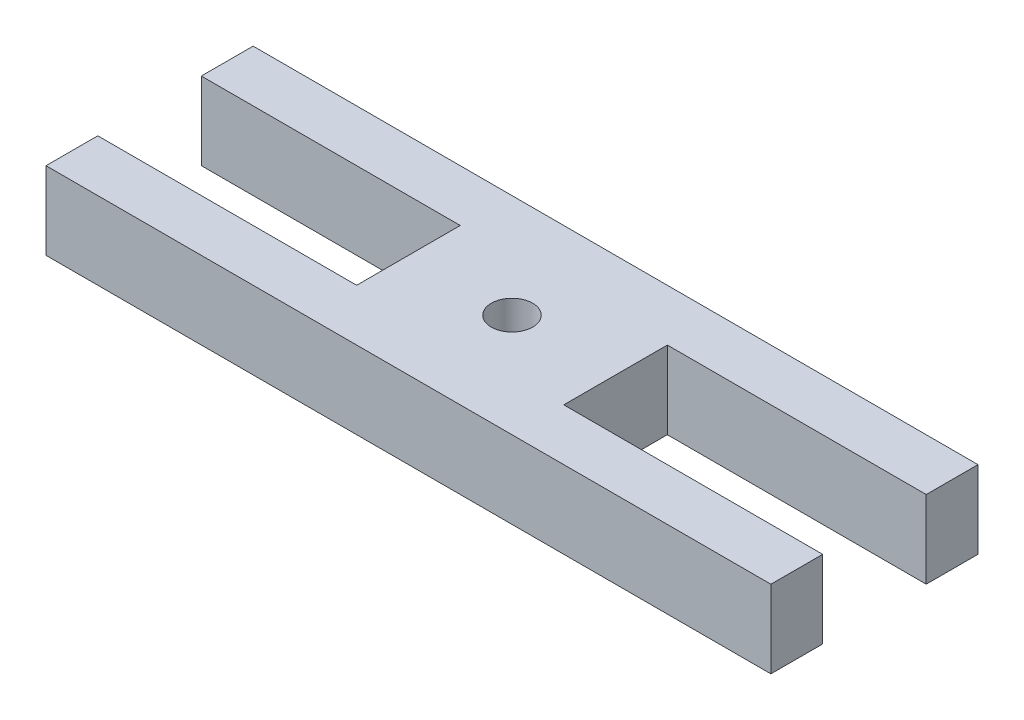
ISO-10303-21;
HEADER;
FILE_DESCRIPTION(('STEP AP214'),'2;1');
FILE_NAME('part.step','',(''),(''),'','','');
FILE_SCHEMA(('AUTOMOTIVE_DESIGN { 1 0 10303 214 1 1 1 1 }'));
ENDSEC;
DATA;
#1=APPLICATION_CONTEXT('core data for automotive mechanical design processes');
#2=APPLICATION_PROTOCOL_DEFINITION('international standard','automotive_design',2000,#1);
#3=PRODUCT_CONTEXT('',#1,'mechanical');
#4=PRODUCT('Part','Part','',(#3));
#5=PRODUCT_RELATED_PRODUCT_CATEGORY('part','',(#4));
#6=PRODUCT_DEFINITION_FORMATION('','',#4);
#7=PRODUCT_DEFINITION_CONTEXT('part definition',#1,'design');
#8=PRODUCT_DEFINITION('design','',#6,#7);
#9=PRODUCT_DEFINITION_SHAPE('','',#8);
#10=(LENGTH_UNIT() NAMED_UNIT(*) SI_UNIT(.MILLI.,.METRE.));
#11=(NAMED_UNIT(*) PLANE_ANGLE_UNIT() SI_UNIT($,.RADIAN.));
#12=(NAMED_UNIT(*) SI_UNIT($,.STERADIAN.) SOLID_ANGLE_UNIT());
#13=UNCERTAINTY_MEASURE_WITH_UNIT(LENGTH_MEASURE(1.E-05),#10,'distance_accuracy_value','');
#14=(GEOMETRIC_REPRESENTATION_CONTEXT(3) GLOBAL_UNCERTAINTY_ASSIGNED_CONTEXT((#13)) GLOBAL_UNIT_ASSIGNED_CONTEXT((#10,
#11,#12)) REPRESENTATION_CONTEXT('',''));
#15=CARTESIAN_POINT('',(0.,0.,0.));
#16=DIRECTION('',(0.,0.,1.));
#17=DIRECTION('',(1.,0.,0.));
#18=AXIS2_PLACEMENT_3D('',#15,#16,#17);
#19=CARTESIAN_POINT('',(-34.5830738893269,1.5,0.));
#20=DIRECTION('',(-1.,0.,0.));
#21=DIRECTION('',(0.,0.,1.));
#22=AXIS2_PLACEMENT_3D('',#19,#20,#21);
#23=PLANE('',#22);
#24=DIRECTION('',(0.,0.,-1.));
#25=VECTOR('',#24,1.);
#26=CARTESIAN_POINT('',(-34.5830738893269,0.,0.));
#27=LINE('',#26,#25);
#28=CARTESIAN_POINT('',(-34.5830738893269,0.,-22.4061702796662));
#29=VERTEX_POINT('',#28);
#30=CARTESIAN_POINT('',(-34.5830738893269,0.,-23.4061702796662));
#31=VERTEX_POINT('',#30);
#32=EDGE_CURVE('E155',#29,#31,#27,.T.);
#33=ORIENTED_EDGE('',*,*,#32,.F.);
#34=DIRECTION('',(0.,-1.,0.));
#35=VECTOR('',#34,1.);
#36=CARTESIAN_POINT('',(-34.5830738893269,1.5,-22.4061702796662));
#37=LINE('',#36,#35);
#38=CARTESIAN_POINT('',(-34.5830738893269,1.5,-22.4061702796662));
#39=VERTEX_POINT('',#38);
#40=EDGE_CURVE('E11',#39,#29,#37,.T.);
#41=ORIENTED_EDGE('',*,*,#40,.F.);
#42=DIRECTION('',(0.,0.,-1.));
#43=VECTOR('',#42,1.);
#44=CARTESIAN_POINT('',(-34.5830738893269,1.5,0.));
#45=LINE('',#44,#43);
#46=CARTESIAN_POINT('',(-34.5830738893269,1.5,-23.4061702796662));
#47=VERTEX_POINT('',#46);
#48=EDGE_CURVE('E229',#39,#47,#45,.T.);
#49=ORIENTED_EDGE('',*,*,#48,.T.);
#50=DIRECTION('',(0.,-1.,0.));
#51=VECTOR('',#50,1.);
#52=CARTESIAN_POINT('',(-34.5830738893269,1.5,-23.4061702796662));
#53=LINE('',#52,#51);
#54=EDGE_CURVE('E52',#47,#31,#53,.T.);
#55=ORIENTED_EDGE('',*,*,#54,.T.);
#56=EDGE_LOOP('',(#33,#41,#49,#55));
#57=FACE_BOUND('',#56,.T.);
#58=ADVANCED_FACE('F35',(#57),#23,.T.);
#59=CARTESIAN_POINT('',(0.,1.5,-22.4061702796662));
#60=DIRECTION('',(0.,0.,1.));
#61=DIRECTION('',(1.,0.,0.));
#62=AXIS2_PLACEMENT_3D('',#59,#60,#61);
#63=PLANE('',#62);
#64=DIRECTION('',(-1.,0.,0.));
#65=VECTOR('',#64,1.);
#66=CARTESIAN_POINT('',(0.,0.,-22.4061702796662));
#67=LINE('',#66,#65);
#68=CARTESIAN_POINT('',(-20.5830738893269,0.,-22.4061702796662));
#69=VERTEX_POINT('',#68);
#70=EDGE_CURVE('E157',#69,#29,#67,.T.);
#71=ORIENTED_EDGE('',*,*,#70,.F.);
#72=DIRECTION('',(0.,-1.,0.));
#73=VECTOR('',#72,1.);
#74=CARTESIAN_POINT('',(-20.5830738893269,1.5,-22.4061702796662));
#75=LINE('',#74,#73);
#76=CARTESIAN_POINT('',(-20.5830738893269,1.5,-22.4061702796662));
#77=VERTEX_POINT('',#76);
#78=EDGE_CURVE('E44',#77,#69,#75,.T.);
#79=ORIENTED_EDGE('',*,*,#78,.F.);
#80=DIRECTION('',(-1.,0.,0.));
#81=VECTOR('',#80,1.);
#82=CARTESIAN_POINT('',(0.,1.5,-22.4061702796662));
#83=LINE('',#82,#81);
#84=EDGE_CURVE('E225',#77,#39,#83,.T.);
#85=ORIENTED_EDGE('',*,*,#84,.T.);
#86=ORIENTED_EDGE('',*,*,#40,.T.);
#87=EDGE_LOOP('',(#71,#79,#85,#86));
#88=FACE_BOUND('',#87,.T.);
#89=ADVANCED_FACE('F213',(#88),#63,.T.);
#90=CARTESIAN_POINT('',(-20.5830738893269,1.5,0.));
#91=DIRECTION('',(1.,0.,0.));
#92=DIRECTION('',(0.,0.,-1.));
#93=AXIS2_PLACEMENT_3D('',#90,#91,#92);
#94=PLANE('',#93);
#95=DIRECTION('',(0.,0.,1.));
#96=VECTOR('',#95,1.);
#97=CARTESIAN_POINT('',(-20.5830738893269,0.,0.));
#98=LINE('',#97,#96);
#99=CARTESIAN_POINT('',(-20.5830738893269,0.,-23.4061702796662));
#100=VERTEX_POINT('',#99);
#101=EDGE_CURVE('E160',#100,#69,#98,.T.);
#102=ORIENTED_EDGE('',*,*,#101,.F.);
#103=DIRECTION('',(0.,-1.,0.));
#104=VECTOR('',#103,1.);
#105=CARTESIAN_POINT('',(-20.5830738893269,1.5,-23.4061702796662));
#106=LINE('',#105,#104);
#107=CARTESIAN_POINT('',(-20.5830738893269,1.5,-23.4061702796662));
#108=VERTEX_POINT('',#107);
#109=EDGE_CURVE('E202',#108,#100,#106,.T.);
#110=ORIENTED_EDGE('',*,*,#109,.F.);
#111=DIRECTION('',(0.,0.,1.));
#112=VECTOR('',#111,1.);
#113=CARTESIAN_POINT('',(-20.5830738893269,1.5,0.));
#114=LINE('',#113,#112);
#115=EDGE_CURVE('E209',#108,#77,#114,.T.);
#116=ORIENTED_EDGE('',*,*,#115,.T.);
#117=ORIENTED_EDGE('',*,*,#78,.T.);
#118=EDGE_LOOP('',(#102,#110,#116,#117));
#119=FACE_BOUND('',#118,.T.);
#120=ADVANCED_FACE('F207',(#119),#94,.T.);
#121=CARTESIAN_POINT('',(0.,1.5,-23.4061702796662));
#122=DIRECTION('',(0.,0.,-1.));
#123=DIRECTION('',(-1.,0.,0.));
#124=AXIS2_PLACEMENT_3D('',#121,#122,#123);
#125=PLANE('',#124);
#126=DIRECTION('',(1.,0.,0.));
#127=VECTOR('',#126,1.);
#128=CARTESIAN_POINT('',(0.,0.,-23.4061702796662));
#129=LINE('',#128,#127);
#130=CARTESIAN_POINT('',(-25.5830738893269,0.,-23.4061702796662));
#131=VERTEX_POINT('',#130);
#132=EDGE_CURVE('E163',#131,#100,#129,.T.);
#133=ORIENTED_EDGE('',*,*,#132,.F.);
#134=DIRECTION('',(0.,-1.,0.));
#135=VECTOR('',#134,1.);
#136=CARTESIAN_POINT('',(-25.5830738893269,1.5,-23.4061702796662));
#137=LINE('',#136,#135);
#138=CARTESIAN_POINT('',(-25.5830738893269,1.5,-23.4061702796662));
#139=VERTEX_POINT('',#138);
#140=EDGE_CURVE('E200',#139,#131,#137,.T.);
#141=ORIENTED_EDGE('',*,*,#140,.F.);
#142=DIRECTION('',(1.,0.,0.));
#143=VECTOR('',#142,1.);
#144=CARTESIAN_POINT('',(0.,1.5,-23.4061702796662));
#145=LINE('',#144,#143);
#146=EDGE_CURVE('E222',#139,#108,#145,.T.);
#147=ORIENTED_EDGE('',*,*,#146,.T.);
#148=ORIENTED_EDGE('',*,*,#109,.T.);
#149=EDGE_LOOP('',(#133,#141,#147,#148));
#150=FACE_BOUND('',#149,.T.);
#151=ADVANCED_FACE('F219',(#150),#125,.T.);
#152=CARTESIAN_POINT('',(-25.5830738893269,1.5,0.));
#153=DIRECTION('',(1.,0.,0.));
#154=DIRECTION('',(0.,0.,-1.));
#155=AXIS2_PLACEMENT_3D('',#152,#153,#154);
#156=PLANE('',#155);
#157=DIRECTION('',(0.,0.,1.));
#158=VECTOR('',#157,1.);
#159=CARTESIAN_POINT('',(-25.5830738893269,0.,0.));
#160=LINE('',#159,#158);
#161=CARTESIAN_POINT('',(-25.5830738893269,0.,-25.4061702796662));
#162=VERTEX_POINT('',#161);
#163=EDGE_CURVE('E166',#162,#131,#160,.T.);
#164=ORIENTED_EDGE('',*,*,#163,.F.);
#165=DIRECTION('',(0.,-1.,0.));
#166=VECTOR('',#165,1.);
#167=CARTESIAN_POINT('',(-25.5830738893269,1.5,-25.4061702796662));
#168=LINE('',#167,#166);
#169=CARTESIAN_POINT('',(-25.5830738893269,1.5,-25.4061702796662));
#170=VERTEX_POINT('',#169);
#171=EDGE_CURVE('E198',#170,#162,#168,.T.);
#172=ORIENTED_EDGE('',*,*,#171,.F.);
#173=DIRECTION('',(0.,0.,1.));
#174=VECTOR('',#173,1.);
#175=CARTESIAN_POINT('',(-25.5830738893269,1.5,0.));
#176=LINE('',#175,#174);
#177=EDGE_CURVE('E227',#170,#139,#176,.T.);
#178=ORIENTED_EDGE('',*,*,#177,.T.);
#179=ORIENTED_EDGE('',*,*,#140,.T.);
#180=EDGE_LOOP('',(#164,#172,#178,#179));
#181=FACE_BOUND('',#180,.T.);
#182=ADVANCED_FACE('F267',(#181),#156,.T.);
#183=CARTESIAN_POINT('',(0.,1.5,-25.4061702796662));
#184=DIRECTION('',(0.,0.,1.));
#185=DIRECTION('',(1.,0.,0.));
#186=AXIS2_PLACEMENT_3D('',#183,#184,#185);
#187=PLANE('',#186);
#188=DIRECTION('',(-1.,0.,0.));
#189=VECTOR('',#188,1.);
#190=CARTESIAN_POINT('',(0.,0.,-25.4061702796662));
#191=LINE('',#190,#189);
#192=CARTESIAN_POINT('',(-20.5830738893269,0.,-25.4061702796662));
#193=VERTEX_POINT('',#192);
#194=EDGE_CURVE('E169',#193,#162,#191,.T.);
#195=ORIENTED_EDGE('',*,*,#194,.F.);
#196=DIRECTION('',(0.,-1.,0.));
#197=VECTOR('',#196,1.);
#198=CARTESIAN_POINT('',(-20.5830738893269,1.5,-25.4061702796662));
#199=LINE('',#198,#197);
#200=CARTESIAN_POINT('',(-20.5830738893269,1.5,-25.4061702796662));
#201=VERTEX_POINT('',#200);
#202=EDGE_CURVE('E196',#201,#193,#199,.T.);
#203=ORIENTED_EDGE('',*,*,#202,.F.);
#204=DIRECTION('',(-1.,0.,0.));
#205=VECTOR('',#204,1.);
#206=CARTESIAN_POINT('',(0.,1.5,-25.4061702796662));
#207=LINE('',#206,#205);
#208=EDGE_CURVE('E234',#201,#170,#207,.T.);
#209=ORIENTED_EDGE('',*,*,#208,.T.);
#210=ORIENTED_EDGE('',*,*,#171,.T.);
#211=EDGE_LOOP('',(#195,#203,#209,#210));
#212=FACE_BOUND('',#211,.T.);
#213=ADVANCED_FACE('F270',(#212),#187,.T.);
#214=CARTESIAN_POINT('',(-20.5830738893269,1.5,0.));
#215=DIRECTION('',(-1.,0.,0.));
#216=DIRECTION('',(0.,0.,1.));
#217=AXIS2_PLACEMENT_3D('',#214,#215,#216);
#218=PLANE('',#217);
#219=DIRECTION('',(0.,0.,-1.));
#220=VECTOR('',#219,1.);
#221=CARTESIAN_POINT('',(-20.5830738893269,0.,0.));
#222=LINE('',#221,#220);
#223=CARTESIAN_POINT('',(-20.5830738893269,0.,-26.4061702796662));
#224=VERTEX_POINT('',#223);
#225=EDGE_CURVE('E172',#193,#224,#222,.T.);
#226=ORIENTED_EDGE('',*,*,#225,.T.);
#227=DIRECTION('',(0.,-1.,0.));
#228=VECTOR('',#227,1.);
#229=CARTESIAN_POINT('',(-20.5830738893269,1.5,-26.4061702796662));
#230=LINE('',#229,#228);
#231=CARTESIAN_POINT('',(-20.5830738893269,1.5,-26.4061702796662));
#232=VERTEX_POINT('',#231);
#233=EDGE_CURVE('E193',#232,#224,#230,.T.);
#234=ORIENTED_EDGE('',*,*,#233,.F.);
#235=DIRECTION('',(0.,0.,-1.));
#236=VECTOR('',#235,1.);
#237=CARTESIAN_POINT('',(-20.5830738893269,1.5,0.));
#238=LINE('',#237,#236);
#239=EDGE_CURVE('E237',#201,#232,#238,.T.);
#240=ORIENTED_EDGE('',*,*,#239,.F.);
#241=ORIENTED_EDGE('',*,*,#202,.T.);
#242=EDGE_LOOP('',(#226,#234,#240,#241));
#243=FACE_BOUND('',#242,.T.);
#244=ADVANCED_FACE('F274',(#243),#218,.F.);
#245=CARTESIAN_POINT('',(0.,1.5,-26.4061702796662));
#246=DIRECTION('',(0.,0.,1.));
#247=DIRECTION('',(1.,0.,0.));
#248=AXIS2_PLACEMENT_3D('',#245,#246,#247);
#249=PLANE('',#248);
#250=DIRECTION('',(-1.,0.,0.));
#251=VECTOR('',#250,1.);
#252=CARTESIAN_POINT('',(0.,0.,-26.4061702796662));
#253=LINE('',#252,#251);
#254=CARTESIAN_POINT('',(-34.5830738893269,0.,-26.4061702796662));
#255=VERTEX_POINT('',#254);
#256=EDGE_CURVE('E175',#224,#255,#253,.T.);
#257=ORIENTED_EDGE('',*,*,#256,.T.);
#258=DIRECTION('',(0.,-1.,0.));
#259=VECTOR('',#258,1.);
#260=CARTESIAN_POINT('',(-34.5830738893269,1.5,-26.4061702796662));
#261=LINE('',#260,#259);
#262=CARTESIAN_POINT('',(-34.5830738893269,1.5,-26.4061702796662));
#263=VERTEX_POINT('',#262);
#264=EDGE_CURVE('E191',#263,#255,#261,.T.);
#265=ORIENTED_EDGE('',*,*,#264,.F.);
#266=DIRECTION('',(-1.,0.,0.));
#267=VECTOR('',#266,1.);
#268=CARTESIAN_POINT('',(0.,1.5,-26.4061702796662));
#269=LINE('',#268,#267);
#270=EDGE_CURVE('E240',#232,#263,#269,.T.);
#271=ORIENTED_EDGE('',*,*,#270,.F.);
#272=ORIENTED_EDGE('',*,*,#233,.T.);
#273=EDGE_LOOP('',(#257,#265,#271,#272));
#274=FACE_BOUND('',#273,.T.);
#275=ADVANCED_FACE('F278',(#274),#249,.F.);
#276=CARTESIAN_POINT('',(-34.5830738893269,1.5,0.));
#277=DIRECTION('',(-1.,0.,0.));
#278=DIRECTION('',(0.,0.,1.));
#279=AXIS2_PLACEMENT_3D('',#276,#277,#278);
#280=PLANE('',#279);
#281=DIRECTION('',(0.,0.,-1.));
#282=VECTOR('',#281,1.);
#283=CARTESIAN_POINT('',(-34.5830738893269,0.,0.));
#284=LINE('',#283,#282);
#285=CARTESIAN_POINT('',(-34.5830738893269,0.,-25.4061702796662));
#286=VERTEX_POINT('',#285);
#287=EDGE_CURVE('E178',#286,#255,#284,.T.);
#288=ORIENTED_EDGE('',*,*,#287,.F.);
#289=DIRECTION('',(0.,-1.,0.));
#290=VECTOR('',#289,1.);
#291=CARTESIAN_POINT('',(-34.5830738893269,1.5,-25.4061702796662));
#292=LINE('',#291,#290);
#293=CARTESIAN_POINT('',(-34.5830738893269,1.5,-25.4061702796662));
#294=VERTEX_POINT('',#293);
#295=EDGE_CURVE('E135',#294,#286,#292,.T.);
#296=ORIENTED_EDGE('',*,*,#295,.F.);
#297=DIRECTION('',(0.,0.,-1.));
#298=VECTOR('',#297,1.);
#299=CARTESIAN_POINT('',(-34.5830738893269,1.5,0.));
#300=LINE('',#299,#298);
#301=EDGE_CURVE('E144',#294,#263,#300,.T.);
#302=ORIENTED_EDGE('',*,*,#301,.T.);
#303=ORIENTED_EDGE('',*,*,#264,.T.);
#304=EDGE_LOOP('',(#288,#296,#302,#303));
#305=FACE_BOUND('',#304,.T.);
#306=ADVANCED_FACE('F243',(#305),#280,.T.);
#307=CARTESIAN_POINT('',(0.,1.5,-25.4061702796662));
#308=DIRECTION('',(0.,0.,1.));
#309=DIRECTION('',(1.,0.,0.));
#310=AXIS2_PLACEMENT_3D('',#307,#308,#309);
#311=PLANE('',#310);
#312=DIRECTION('',(-1.,0.,0.));
#313=VECTOR('',#312,1.);
#314=CARTESIAN_POINT('',(0.,0.,-25.4061702796662));
#315=LINE('',#314,#313);
#316=CARTESIAN_POINT('',(-29.5830738893269,0.,-25.4061702796662));
#317=VERTEX_POINT('',#316);
#318=EDGE_CURVE('E131',#317,#286,#315,.T.);
#319=ORIENTED_EDGE('',*,*,#318,.F.);
#320=DIRECTION('',(0.,-1.,0.));
#321=VECTOR('',#320,1.);
#322=CARTESIAN_POINT('',(-29.5830738893269,1.5,-25.4061702796662));
#323=LINE('',#322,#321);
#324=CARTESIAN_POINT('',(-29.5830738893269,1.5,-25.4061702796662));
#325=VERTEX_POINT('',#324);
#326=EDGE_CURVE('E126',#325,#317,#323,.T.);
#327=ORIENTED_EDGE('',*,*,#326,.F.);
#328=DIRECTION('',(-1.,0.,0.));
#329=VECTOR('',#328,1.);
#330=CARTESIAN_POINT('',(0.,1.5,-25.4061702796662));
#331=LINE('',#330,#329);
#332=EDGE_CURVE('E129',#325,#294,#331,.T.);
#333=ORIENTED_EDGE('',*,*,#332,.T.);
#334=ORIENTED_EDGE('',*,*,#295,.T.);
#335=EDGE_LOOP('',(#319,#327,#333,#334));
#336=FACE_BOUND('',#335,.T.);
#337=ADVANCED_FACE('F128',(#336),#311,.T.);
#338=CARTESIAN_POINT('',(-29.5830738893269,1.5,0.));
#339=DIRECTION('',(-1.,0.,0.));
#340=DIRECTION('',(0.,0.,1.));
#341=AXIS2_PLACEMENT_3D('',#338,#339,#340);
#342=PLANE('',#341);
#343=DIRECTION('',(0.,0.,-1.));
#344=VECTOR('',#343,1.);
#345=CARTESIAN_POINT('',(-29.5830738893269,0.,0.));
#346=LINE('',#345,#344);
#347=CARTESIAN_POINT('',(-29.5830738893269,0.,-23.4061702796662));
#348=VERTEX_POINT('',#347);
#349=EDGE_CURVE('E182',#348,#317,#346,.T.);
#350=ORIENTED_EDGE('',*,*,#349,.F.);
#351=DIRECTION('',(0.,-1.,0.));
#352=VECTOR('',#351,1.);
#353=CARTESIAN_POINT('',(-29.5830738893269,1.5,-23.4061702796662));
#354=LINE('',#353,#352);
#355=CARTESIAN_POINT('',(-29.5830738893269,1.5,-23.4061702796662));
#356=VERTEX_POINT('',#355);
#357=EDGE_CURVE('E89',#356,#348,#354,.T.);
#358=ORIENTED_EDGE('',*,*,#357,.F.);
#359=DIRECTION('',(0.,0.,-1.));
#360=VECTOR('',#359,1.);
#361=CARTESIAN_POINT('',(-29.5830738893269,1.5,0.));
#362=LINE('',#361,#360);
#363=EDGE_CURVE('E142',#356,#325,#362,.T.);
#364=ORIENTED_EDGE('',*,*,#363,.T.);
#365=ORIENTED_EDGE('',*,*,#326,.T.);
#366=EDGE_LOOP('',(#350,#358,#364,#365));
#367=FACE_BOUND('',#366,.T.);
#368=ADVANCED_FACE('F146',(#367),#342,.T.);
#369=CARTESIAN_POINT('',(-27.5830738893269,1.5,-24.4061702796662));
#370=DIRECTION('',(0.,-1.,0.));
#371=DIRECTION('',(0.,0.,-1.));
#372=AXIS2_PLACEMENT_3D('',#369,#370,#371);
#373=CYLINDRICAL_SURFACE('',#372,0.400000000000002);
#374=CARTESIAN_POINT('',(-27.5830738893269,1.5,-24.4061702796662));
#375=DIRECTION('',(0.,1.,0.));
#376=DIRECTION('',(0.,0.,1.));
#377=AXIS2_PLACEMENT_3D('',#374,#375,#376);
#378=CIRCLE('',#377,0.400000000000002);
#379=CARTESIAN_POINT('',(-27.5830738893269,1.5,-24.0061702796662));
#380=VERTEX_POINT('',#379);
#381=EDGE_CURVE('E187',#380,#380,#378,.T.);
#382=ORIENTED_EDGE('',*,*,#381,.T.);
#383=EDGE_LOOP('',(#382));
#384=FACE_BOUND('',#383,.T.);
#385=CARTESIAN_POINT('',(-27.5830738893269,0.,-24.4061702796662));
#386=DIRECTION('',(0.,1.,0.));
#387=DIRECTION('',(0.,0.,1.));
#388=AXIS2_PLACEMENT_3D('',#385,#386,#387);
#389=CIRCLE('',#388,0.400000000000002);
#390=CARTESIAN_POINT('',(-27.5830738893269,0.,-24.0061702796662));
#391=VERTEX_POINT('',#390);
#392=EDGE_CURVE('E152',#391,#391,#389,.T.);
#393=ORIENTED_EDGE('',*,*,#392,.F.);
#394=EDGE_LOOP('',(#393));
#395=FACE_BOUND('',#394,.T.);
#396=ADVANCED_FACE('F37',(#384,#395),#373,.F.);
#397=CARTESIAN_POINT('',(0.,1.5,-23.4061702796662));
#398=DIRECTION('',(0.,0.,-1.));
#399=DIRECTION('',(-1.,0.,0.));
#400=AXIS2_PLACEMENT_3D('',#397,#398,#399);
#401=PLANE('',#400);
#402=DIRECTION('',(1.,0.,0.));
#403=VECTOR('',#402,1.);
#404=CARTESIAN_POINT('',(0.,0.,-23.4061702796662));
#405=LINE('',#404,#403);
#406=EDGE_CURVE('E184',#31,#348,#405,.T.);
#407=ORIENTED_EDGE('',*,*,#406,.F.);
#408=ORIENTED_EDGE('',*,*,#54,.F.);
#409=DIRECTION('',(1.,0.,0.));
#410=VECTOR('',#409,1.);
#411=CARTESIAN_POINT('',(0.,1.5,-23.4061702796662));
#412=LINE('',#411,#410);
#413=EDGE_CURVE('E147',#47,#356,#412,.T.);
#414=ORIENTED_EDGE('',*,*,#413,.T.);
#415=ORIENTED_EDGE('',*,*,#357,.T.);
#416=EDGE_LOOP('',(#407,#408,#414,#415));
#417=FACE_BOUND('',#416,.T.);
#418=ADVANCED_FACE('F245',(#417),#401,.T.);
#419=CARTESIAN_POINT('',(0.,1.5,0.));
#420=DIRECTION('',(0.,1.,0.));
#421=DIRECTION('',(0.,0.,1.));
#422=AXIS2_PLACEMENT_3D('',#419,#420,#421);
#423=PLANE('',#422);
#424=ORIENTED_EDGE('',*,*,#381,.F.);
#425=EDGE_LOOP('',(#424));
#426=FACE_BOUND('',#425,.T.);
#427=ORIENTED_EDGE('',*,*,#48,.F.);
#428=ORIENTED_EDGE('',*,*,#84,.F.);
#429=ORIENTED_EDGE('',*,*,#115,.F.);
#430=ORIENTED_EDGE('',*,*,#146,.F.);
#431=ORIENTED_EDGE('',*,*,#177,.F.);
#432=ORIENTED_EDGE('',*,*,#208,.F.);
#433=ORIENTED_EDGE('',*,*,#239,.T.);
#434=ORIENTED_EDGE('',*,*,#270,.T.);
#435=ORIENTED_EDGE('',*,*,#301,.F.);
#436=ORIENTED_EDGE('',*,*,#332,.F.);
#437=ORIENTED_EDGE('',*,*,#363,.F.);
#438=ORIENTED_EDGE('',*,*,#413,.F.);
#439=EDGE_LOOP('',(#427,#428,#429,#430,#431,#432,#433,#434,#435,#436,#437,#438));
#440=FACE_BOUND('',#439,.T.);
#441=ADVANCED_FACE('F140',(#426,#440),#423,.T.);
#442=CARTESIAN_POINT('',(0.,0.,0.));
#443=DIRECTION('',(0.,1.,0.));
#444=DIRECTION('',(0.,0.,1.));
#445=AXIS2_PLACEMENT_3D('',#442,#443,#444);
#446=PLANE('',#445);
#447=ORIENTED_EDGE('',*,*,#392,.T.);
#448=EDGE_LOOP('',(#447));
#449=FACE_BOUND('',#448,.T.);
#450=ORIENTED_EDGE('',*,*,#32,.T.);
#451=ORIENTED_EDGE('',*,*,#406,.T.);
#452=ORIENTED_EDGE('',*,*,#349,.T.);
#453=ORIENTED_EDGE('',*,*,#318,.T.);
#454=ORIENTED_EDGE('',*,*,#287,.T.);
#455=ORIENTED_EDGE('',*,*,#256,.F.);
#456=ORIENTED_EDGE('',*,*,#225,.F.);
#457=ORIENTED_EDGE('',*,*,#194,.T.);
#458=ORIENTED_EDGE('',*,*,#163,.T.);
#459=ORIENTED_EDGE('',*,*,#132,.T.);
#460=ORIENTED_EDGE('',*,*,#101,.T.);
#461=ORIENTED_EDGE('',*,*,#70,.T.);
#462=EDGE_LOOP('',(#450,#451,#452,#453,#454,#455,#456,#457,#458,#459,#460,#461));
#463=FACE_BOUND('',#462,.T.);
#464=ADVANCED_FACE('F215',(#449,#463),#446,.F.);
#465=CLOSED_SHELL('',(#58,#89,#120,#151,#182,#213,#244,#275,#306,#337,#368,#396,#418,#441,#464));
#466=MANIFOLD_SOLID_BREP('B2',#465);
#467=ADVANCED_BREP_SHAPE_REPRESENTATION('',(#18,#466),#14);
#468=SHAPE_DEFINITION_REPRESENTATION(#9,#467);
ENDSEC;
END-ISO-10303-21;
